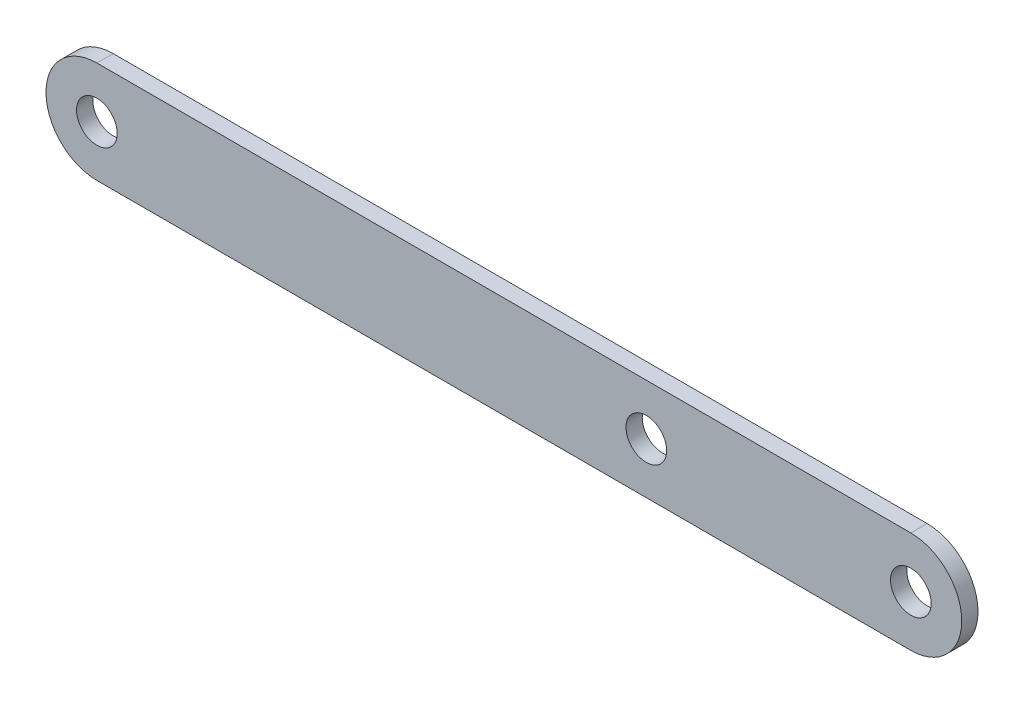
ISO-10303-21;
HEADER;
FILE_DESCRIPTION(('STEP AP214'),'2;1');
FILE_NAME('part.step','',(''),(''),'','','');
FILE_SCHEMA(('AUTOMOTIVE_DESIGN { 1 0 10303 214 1 1 1 1 }'));
ENDSEC;
DATA;
#1=APPLICATION_CONTEXT('core data for automotive mechanical design processes');
#2=APPLICATION_PROTOCOL_DEFINITION('international standard','automotive_design',2000,#1);
#3=PRODUCT_CONTEXT('',#1,'mechanical');
#4=PRODUCT('Part','Part','',(#3));
#5=PRODUCT_RELATED_PRODUCT_CATEGORY('part','',(#4));
#6=PRODUCT_DEFINITION_FORMATION('','',#4);
#7=PRODUCT_DEFINITION_CONTEXT('part definition',#1,'design');
#8=PRODUCT_DEFINITION('design','',#6,#7);
#9=PRODUCT_DEFINITION_SHAPE('','',#8);
#10=(LENGTH_UNIT() NAMED_UNIT(*) SI_UNIT(.MILLI.,.METRE.));
#11=(NAMED_UNIT(*) PLANE_ANGLE_UNIT() SI_UNIT($,.RADIAN.));
#12=(NAMED_UNIT(*) SI_UNIT($,.STERADIAN.) SOLID_ANGLE_UNIT());
#13=UNCERTAINTY_MEASURE_WITH_UNIT(LENGTH_MEASURE(1.E-05),#10,'distance_accuracy_value','');
#14=(GEOMETRIC_REPRESENTATION_CONTEXT(3) GLOBAL_UNCERTAINTY_ASSIGNED_CONTEXT((#13)) GLOBAL_UNIT_ASSIGNED_CONTEXT((#10,
#11,#12)) REPRESENTATION_CONTEXT('',''));
#15=CARTESIAN_POINT('',(0.,0.,0.));
#16=DIRECTION('',(0.,0.,1.));
#17=DIRECTION('',(1.,0.,0.));
#18=AXIS2_PLACEMENT_3D('',#15,#16,#17);
#19=CARTESIAN_POINT('',(-200.,0.,4.));
#20=DIRECTION('',(0.,0.,-1.));
#21=DIRECTION('',(-1.,0.,0.));
#22=AXIS2_PLACEMENT_3D('',#19,#20,#21);
#23=CYLINDRICAL_SURFACE('',#22,25.);
#24=CARTESIAN_POINT('',(-200.,0.,-4.));
#25=DIRECTION('',(0.,0.,1.));
#26=DIRECTION('',(1.,0.,0.));
#27=AXIS2_PLACEMENT_3D('',#24,#25,#26);
#28=CIRCLE('',#27,25.);
#29=CARTESIAN_POINT('',(-200.,25.,-4.));
#30=VERTEX_POINT('',#29);
#31=CARTESIAN_POINT('',(-200.,-25.,-4.));
#32=VERTEX_POINT('',#31);
#33=EDGE_CURVE('E101',#30,#32,#28,.T.);
#34=ORIENTED_EDGE('',*,*,#33,.T.);
#35=DIRECTION('',(0.,0.,-1.));
#36=VECTOR('',#35,1.);
#37=CARTESIAN_POINT('',(-200.,-25.,4.));
#38=LINE('',#37,#36);
#39=CARTESIAN_POINT('',(-200.,-25.,4.));
#40=VERTEX_POINT('',#39);
#41=EDGE_CURVE('E11',#40,#32,#38,.T.);
#42=ORIENTED_EDGE('',*,*,#41,.F.);
#43=CARTESIAN_POINT('',(-200.,0.,4.));
#44=DIRECTION('',(0.,0.,1.));
#45=DIRECTION('',(1.,0.,0.));
#46=AXIS2_PLACEMENT_3D('',#43,#44,#45);
#47=CIRCLE('',#46,25.);
#48=CARTESIAN_POINT('',(-200.,25.,4.));
#49=VERTEX_POINT('',#48);
#50=EDGE_CURVE('E89',#49,#40,#47,.T.);
#51=ORIENTED_EDGE('',*,*,#50,.F.);
#52=DIRECTION('',(0.,0.,-1.));
#53=VECTOR('',#52,1.);
#54=CARTESIAN_POINT('',(-200.,25.,4.));
#55=LINE('',#54,#53);
#56=EDGE_CURVE('E97',#49,#30,#55,.T.);
#57=ORIENTED_EDGE('',*,*,#56,.T.);
#58=EDGE_LOOP('',(#34,#42,#51,#57));
#59=FACE_BOUND('',#58,.T.);
#60=ADVANCED_FACE('F38',(#59),#23,.T.);
#61=CARTESIAN_POINT('',(-200.,-25.,4.));
#62=DIRECTION('',(0.,1.,0.));
#63=DIRECTION('',(-1.,0.,0.));
#64=AXIS2_PLACEMENT_3D('',#61,#62,#63);
#65=PLANE('',#64);
#66=DIRECTION('',(1.,0.,0.));
#67=VECTOR('',#66,1.);
#68=CARTESIAN_POINT('',(-200.,-25.,-4.));
#69=LINE('',#68,#67);
#70=CARTESIAN_POINT('',(200.,-25.,-4.));
#71=VERTEX_POINT('',#70);
#72=EDGE_CURVE('E93',#32,#71,#69,.T.);
#73=ORIENTED_EDGE('',*,*,#72,.T.);
#74=DIRECTION('',(0.,0.,-1.));
#75=VECTOR('',#74,1.);
#76=CARTESIAN_POINT('',(200.,-25.,4.));
#77=LINE('',#76,#75);
#78=CARTESIAN_POINT('',(200.,-25.,4.));
#79=VERTEX_POINT('',#78);
#80=EDGE_CURVE('E46',#79,#71,#77,.T.);
#81=ORIENTED_EDGE('',*,*,#80,.F.);
#82=DIRECTION('',(1.,0.,0.));
#83=VECTOR('',#82,1.);
#84=CARTESIAN_POINT('',(-200.,-25.,4.));
#85=LINE('',#84,#83);
#86=EDGE_CURVE('E84',#40,#79,#85,.T.);
#87=ORIENTED_EDGE('',*,*,#86,.F.);
#88=ORIENTED_EDGE('',*,*,#41,.T.);
#89=EDGE_LOOP('',(#73,#81,#87,#88));
#90=FACE_BOUND('',#89,.T.);
#91=ADVANCED_FACE('F92',(#90),#65,.F.);
#92=CARTESIAN_POINT('',(200.,0.,4.));
#93=DIRECTION('',(0.,0.,-1.));
#94=DIRECTION('',(-1.,0.,0.));
#95=AXIS2_PLACEMENT_3D('',#92,#93,#94);
#96=CYLINDRICAL_SURFACE('',#95,25.);
#97=CARTESIAN_POINT('',(200.,0.,-4.));
#98=DIRECTION('',(0.,0.,1.));
#99=DIRECTION('',(1.,0.,0.));
#100=AXIS2_PLACEMENT_3D('',#97,#98,#99);
#101=CIRCLE('',#100,25.);
#102=CARTESIAN_POINT('',(200.,25.0000000000001,-4.));
#103=VERTEX_POINT('',#102);
#104=EDGE_CURVE('E71',#71,#103,#101,.T.);
#105=ORIENTED_EDGE('',*,*,#104,.T.);
#106=DIRECTION('',(0.,0.,-1.));
#107=VECTOR('',#106,1.);
#108=CARTESIAN_POINT('',(200.,25.0000000000001,4.));
#109=LINE('',#108,#107);
#110=CARTESIAN_POINT('',(200.,25.0000000000001,4.));
#111=VERTEX_POINT('',#110);
#112=EDGE_CURVE('E94',#111,#103,#109,.T.);
#113=ORIENTED_EDGE('',*,*,#112,.F.);
#114=CARTESIAN_POINT('',(200.,0.,4.));
#115=DIRECTION('',(0.,0.,1.));
#116=DIRECTION('',(1.,0.,0.));
#117=AXIS2_PLACEMENT_3D('',#114,#115,#116);
#118=CIRCLE('',#117,25.);
#119=EDGE_CURVE('E87',#79,#111,#118,.T.);
#120=ORIENTED_EDGE('',*,*,#119,.F.);
#121=ORIENTED_EDGE('',*,*,#80,.T.);
#122=EDGE_LOOP('',(#105,#113,#120,#121));
#123=FACE_BOUND('',#122,.T.);
#124=ADVANCED_FACE('F95',(#123),#96,.T.);
#125=CARTESIAN_POINT('',(-200.,25.,4.));
#126=DIRECTION('',(0.,-1.,0.));
#127=DIRECTION('',(1.,0.,0.));
#128=AXIS2_PLACEMENT_3D('',#125,#126,#127);
#129=PLANE('',#128);
#130=DIRECTION('',(-1.,0.,0.));
#131=VECTOR('',#130,1.);
#132=CARTESIAN_POINT('',(-200.,25.,-4.));
#133=LINE('',#132,#131);
#134=EDGE_CURVE('E77',#103,#30,#133,.T.);
#135=ORIENTED_EDGE('',*,*,#134,.T.);
#136=ORIENTED_EDGE('',*,*,#56,.F.);
#137=DIRECTION('',(-1.,0.,0.));
#138=VECTOR('',#137,1.);
#139=CARTESIAN_POINT('',(-200.,25.,4.));
#140=LINE('',#139,#138);
#141=EDGE_CURVE('E54',#111,#49,#140,.T.);
#142=ORIENTED_EDGE('',*,*,#141,.F.);
#143=ORIENTED_EDGE('',*,*,#112,.T.);
#144=EDGE_LOOP('',(#135,#136,#142,#143));
#145=FACE_BOUND('',#144,.T.);
#146=ADVANCED_FACE('F109',(#145),#129,.F.);
#147=CARTESIAN_POINT('',(-200.,0.,4.));
#148=DIRECTION('',(0.,0.,1.));
#149=DIRECTION('',(1.,0.,0.));
#150=AXIS2_PLACEMENT_3D('',#147,#148,#149);
#151=PLANE('',#150);
#152=CARTESIAN_POINT('',(70.,0.,4.));
#153=DIRECTION('',(0.,0.,-1.));
#154=DIRECTION('',(-1.,0.,0.));
#155=AXIS2_PLACEMENT_3D('',#152,#153,#154);
#156=CIRCLE('',#155,10.);
#157=CARTESIAN_POINT('',(60.,0.,4.));
#158=VERTEX_POINT('',#157);
#159=EDGE_CURVE('E119',#158,#158,#156,.T.);
#160=ORIENTED_EDGE('',*,*,#159,.T.);
#161=EDGE_LOOP('',(#160));
#162=FACE_BOUND('',#161,.T.);
#163=CARTESIAN_POINT('',(-200.,0.,4.));
#164=DIRECTION('',(0.,0.,1.));
#165=DIRECTION('',(1.,0.,0.));
#166=AXIS2_PLACEMENT_3D('',#163,#164,#165);
#167=CIRCLE('',#166,10.);
#168=CARTESIAN_POINT('',(-190.,0.,4.));
#169=VERTEX_POINT('',#168);
#170=EDGE_CURVE('E122',#169,#169,#167,.T.);
#171=ORIENTED_EDGE('',*,*,#170,.F.);
#172=EDGE_LOOP('',(#171));
#173=FACE_BOUND('',#172,.T.);
#174=CARTESIAN_POINT('',(200.,0.,4.));
#175=DIRECTION('',(0.,0.,1.));
#176=DIRECTION('',(1.,0.,0.));
#177=AXIS2_PLACEMENT_3D('',#174,#175,#176);
#178=CIRCLE('',#177,10.);
#179=CARTESIAN_POINT('',(210.,0.,4.));
#180=VERTEX_POINT('',#179);
#181=EDGE_CURVE('E115',#180,#180,#178,.T.);
#182=ORIENTED_EDGE('',*,*,#181,.F.);
#183=EDGE_LOOP('',(#182));
#184=FACE_BOUND('',#183,.T.);
#185=ORIENTED_EDGE('',*,*,#50,.T.);
#186=ORIENTED_EDGE('',*,*,#86,.T.);
#187=ORIENTED_EDGE('',*,*,#119,.T.);
#188=ORIENTED_EDGE('',*,*,#141,.T.);
#189=EDGE_LOOP('',(#185,#186,#187,#188));
#190=FACE_BOUND('',#189,.T.);
#191=ADVANCED_FACE('F85',(#162,#173,#184,#190),#151,.T.);
#192=CARTESIAN_POINT('',(-200.,0.,-4.));
#193=DIRECTION('',(0.,0.,1.));
#194=DIRECTION('',(1.,0.,0.));
#195=AXIS2_PLACEMENT_3D('',#192,#193,#194);
#196=PLANE('',#195);
#197=CARTESIAN_POINT('',(70.,0.,-4.));
#198=DIRECTION('',(0.,0.,-1.));
#199=DIRECTION('',(-1.,0.,0.));
#200=AXIS2_PLACEMENT_3D('',#197,#198,#199);
#201=CIRCLE('',#200,10.);
#202=CARTESIAN_POINT('',(60.,0.,-4.));
#203=VERTEX_POINT('',#202);
#204=EDGE_CURVE('E127',#203,#203,#201,.T.);
#205=ORIENTED_EDGE('',*,*,#204,.F.);
#206=EDGE_LOOP('',(#205));
#207=FACE_BOUND('',#206,.T.);
#208=CARTESIAN_POINT('',(-200.,0.,-4.));
#209=DIRECTION('',(0.,0.,1.));
#210=DIRECTION('',(1.,0.,0.));
#211=AXIS2_PLACEMENT_3D('',#208,#209,#210);
#212=CIRCLE('',#211,10.);
#213=CARTESIAN_POINT('',(-190.,0.,-4.));
#214=VERTEX_POINT('',#213);
#215=EDGE_CURVE('E104',#214,#214,#212,.T.);
#216=ORIENTED_EDGE('',*,*,#215,.T.);
#217=EDGE_LOOP('',(#216));
#218=FACE_BOUND('',#217,.T.);
#219=CARTESIAN_POINT('',(200.,0.,-4.));
#220=DIRECTION('',(0.,0.,1.));
#221=DIRECTION('',(1.,0.,0.));
#222=AXIS2_PLACEMENT_3D('',#219,#220,#221);
#223=CIRCLE('',#222,10.);
#224=CARTESIAN_POINT('',(210.,0.,-4.));
#225=VERTEX_POINT('',#224);
#226=EDGE_CURVE('E118',#225,#225,#223,.T.);
#227=ORIENTED_EDGE('',*,*,#226,.T.);
#228=EDGE_LOOP('',(#227));
#229=FACE_BOUND('',#228,.T.);
#230=ORIENTED_EDGE('',*,*,#33,.F.);
#231=ORIENTED_EDGE('',*,*,#134,.F.);
#232=ORIENTED_EDGE('',*,*,#104,.F.);
#233=ORIENTED_EDGE('',*,*,#72,.F.);
#234=EDGE_LOOP('',(#230,#231,#232,#233));
#235=FACE_BOUND('',#234,.T.);
#236=ADVANCED_FACE('F112',(#207,#218,#229,#235),#196,.F.);
#237=CARTESIAN_POINT('',(200.,0.,-4.));
#238=DIRECTION('',(0.,0.,1.));
#239=DIRECTION('',(1.,0.,0.));
#240=AXIS2_PLACEMENT_3D('',#237,#238,#239);
#241=CYLINDRICAL_SURFACE('',#240,10.);
#242=ORIENTED_EDGE('',*,*,#226,.F.);
#243=EDGE_LOOP('',(#242));
#244=FACE_BOUND('',#243,.T.);
#245=ORIENTED_EDGE('',*,*,#181,.T.);
#246=EDGE_LOOP('',(#245));
#247=FACE_BOUND('',#246,.T.);
#248=ADVANCED_FACE('F144',(#244,#247),#241,.F.);
#249=CARTESIAN_POINT('',(-200.,0.,-4.));
#250=DIRECTION('',(0.,0.,1.));
#251=DIRECTION('',(1.,0.,0.));
#252=AXIS2_PLACEMENT_3D('',#249,#250,#251);
#253=CYLINDRICAL_SURFACE('',#252,10.);
#254=ORIENTED_EDGE('',*,*,#215,.F.);
#255=EDGE_LOOP('',(#254));
#256=FACE_BOUND('',#255,.T.);
#257=ORIENTED_EDGE('',*,*,#170,.T.);
#258=EDGE_LOOP('',(#257));
#259=FACE_BOUND('',#258,.T.);
#260=ADVANCED_FACE('F138',(#256,#259),#253,.F.);
#261=CARTESIAN_POINT('',(70.,0.,4.));
#262=DIRECTION('',(0.,0.,-1.));
#263=DIRECTION('',(-1.,0.,0.));
#264=AXIS2_PLACEMENT_3D('',#261,#262,#263);
#265=CYLINDRICAL_SURFACE('',#264,10.);
#266=ORIENTED_EDGE('',*,*,#159,.F.);
#267=EDGE_LOOP('',(#266));
#268=FACE_BOUND('',#267,.T.);
#269=ORIENTED_EDGE('',*,*,#204,.T.);
#270=EDGE_LOOP('',(#269));
#271=FACE_BOUND('',#270,.T.);
#272=ADVANCED_FACE('F135',(#268,#271),#265,.F.);
#273=CLOSED_SHELL('',(#60,#91,#124,#146,#191,#236,#248,#260,#272));
#274=MANIFOLD_SOLID_BREP('B2',#273);
#275=ADVANCED_BREP_SHAPE_REPRESENTATION('',(#18,#274),#14);
#276=SHAPE_DEFINITION_REPRESENTATION(#9,#275);
ENDSEC;
END-ISO-10303-21;
